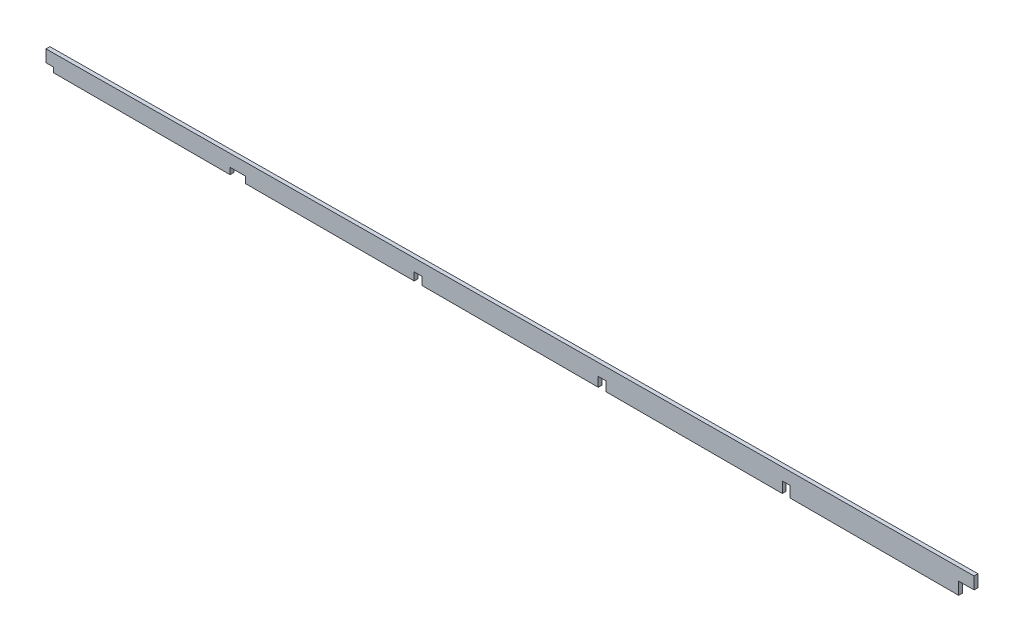
ISO-10303-21;
HEADER;
FILE_DESCRIPTION(('STEP AP214'),'2;1');
FILE_NAME('part.step','',(''),(''),'','','');
FILE_SCHEMA(('AUTOMOTIVE_DESIGN { 1 0 10303 214 1 1 1 1 }'));
ENDSEC;
DATA;
#1=APPLICATION_CONTEXT('core data for automotive mechanical design processes');
#2=APPLICATION_PROTOCOL_DEFINITION('international standard','automotive_design',2000,#1);
#3=PRODUCT_CONTEXT('',#1,'mechanical');
#4=PRODUCT('Part','Part','',(#3));
#5=PRODUCT_RELATED_PRODUCT_CATEGORY('part','',(#4));
#6=PRODUCT_DEFINITION_FORMATION('','',#4);
#7=PRODUCT_DEFINITION_CONTEXT('part definition',#1,'design');
#8=PRODUCT_DEFINITION('design','',#6,#7);
#9=PRODUCT_DEFINITION_SHAPE('','',#8);
#10=(LENGTH_UNIT() NAMED_UNIT(*) SI_UNIT(.MILLI.,.METRE.));
#11=(NAMED_UNIT(*) PLANE_ANGLE_UNIT() SI_UNIT($,.RADIAN.));
#12=(NAMED_UNIT(*) SI_UNIT($,.STERADIAN.) SOLID_ANGLE_UNIT());
#13=UNCERTAINTY_MEASURE_WITH_UNIT(LENGTH_MEASURE(1.E-05),#10,'distance_accuracy_value','');
#14=(GEOMETRIC_REPRESENTATION_CONTEXT(3) GLOBAL_UNCERTAINTY_ASSIGNED_CONTEXT((#13)) GLOBAL_UNIT_ASSIGNED_CONTEXT((#10,
#11,#12)) REPRESENTATION_CONTEXT('',''));
#15=CARTESIAN_POINT('',(0.,0.,0.));
#16=DIRECTION('',(0.,0.,1.));
#17=DIRECTION('',(1.,0.,0.));
#18=AXIS2_PLACEMENT_3D('',#15,#16,#17);
#19=CARTESIAN_POINT('',(0.,0.,0.));
#20=DIRECTION('',(0.,0.,-1.));
#21=DIRECTION('',(-1.,0.,0.));
#22=AXIS2_PLACEMENT_3D('',#19,#20,#21);
#23=PLANE('',#22);
#24=DIRECTION('',(0.,1.,0.));
#25=VECTOR('',#24,1.);
#26=CARTESIAN_POINT('',(88.3255528409319,-0.566216395521648,0.));
#27=LINE('',#26,#25);
#28=CARTESIAN_POINT('',(88.3255528409319,-0.566216395521648,0.));
#29=VERTEX_POINT('',#28);
#30=CARTESIAN_POINT('',(88.3255528409319,4.4065819969315,0.));
#31=VERTEX_POINT('',#30);
#32=EDGE_CURVE('E204',#29,#31,#27,.T.);
#33=ORIENTED_EDGE('',*,*,#32,.F.);
#34=DIRECTION('',(0.99996694520862,0.00813071276950203,0.));
#35=VECTOR('',#34,1.);
#36=CARTESIAN_POINT('',(81.9755528409093,-0.617848128284325,0.));
#37=LINE('',#36,#35);
#38=CARTESIAN_POINT('',(81.9755528409093,-0.617848128284325,0.));
#39=VERTEX_POINT('',#38);
#40=EDGE_CURVE('E275',#39,#29,#37,.T.);
#41=ORIENTED_EDGE('',*,*,#40,.F.);
#42=DIRECTION('',(0.,-1.,0.));
#43=VECTOR('',#42,1.);
#44=CARTESIAN_POINT('',(81.9755528409093,-0.617848128284325,0.));
#45=LINE('',#44,#43);
#46=CARTESIAN_POINT('',(81.9755528409093,-5.67030449490094,0.));
#47=VERTEX_POINT('',#46);
#48=EDGE_CURVE('E272',#39,#47,#45,.T.);
#49=ORIENTED_EDGE('',*,*,#48,.T.);
#50=DIRECTION('',(1.,0.,0.));
#51=VECTOR('',#50,1.);
#52=CARTESIAN_POINT('',(12.7605528406622,-5.67030449490094,0.));
#53=LINE('',#52,#51);
#54=CARTESIAN_POINT('',(12.7605528406622,-5.67030449490094,0.));
#55=VERTEX_POINT('',#54);
#56=EDGE_CURVE('E269',#55,#47,#53,.T.);
#57=ORIENTED_EDGE('',*,*,#56,.F.);
#58=DIRECTION('',(0.,-1.,0.));
#59=VECTOR('',#58,1.);
#60=CARTESIAN_POINT('',(12.7605528406622,-1.18063401539752,0.));
#61=LINE('',#60,#59);
#62=CARTESIAN_POINT('',(12.7605528406622,-1.18063401539752,0.));
#63=VERTEX_POINT('',#62);
#64=EDGE_CURVE('E266',#63,#55,#61,.T.);
#65=ORIENTED_EDGE('',*,*,#64,.F.);
#66=DIRECTION('',(0.99996694520862,0.00813071276950239,0.));
#67=VECTOR('',#66,1.);
#68=CARTESIAN_POINT('',(9.58555284065082,-1.20644988177886,0.));
#69=LINE('',#68,#67);
#70=CARTESIAN_POINT('',(9.58555284065082,-1.20644988177886,0.));
#71=VERTEX_POINT('',#70);
#72=EDGE_CURVE('E263',#71,#63,#69,.T.);
#73=ORIENTED_EDGE('',*,*,#72,.F.);
#74=DIRECTION('',(0.,-1.,0.));
#75=VECTOR('',#74,1.);
#76=CARTESIAN_POINT('',(9.58555284065082,-1.20644988177886,0.));
#77=LINE('',#76,#75);
#78=CARTESIAN_POINT('',(9.58555284065082,-5.67030449490094,0.));
#79=VERTEX_POINT('',#78);
#80=EDGE_CURVE('E260',#71,#79,#77,.T.);
#81=ORIENTED_EDGE('',*,*,#80,.T.);
#82=DIRECTION('',(1.,0.,0.));
#83=VECTOR('',#82,1.);
#84=CARTESIAN_POINT('',(-62.8044471596074,-5.67030449490094,0.));
#85=LINE('',#84,#83);
#86=CARTESIAN_POINT('',(-62.8044471596074,-5.67030449490094,0.));
#87=VERTEX_POINT('',#86);
#88=EDGE_CURVE('E257',#87,#79,#85,.T.);
#89=ORIENTED_EDGE('',*,*,#88,.F.);
#90=DIRECTION('',(0.,-1.,0.));
#91=VECTOR('',#90,1.);
#92=CARTESIAN_POINT('',(-62.8044471596074,-1.79505163527338,0.));
#93=LINE('',#92,#91);
#94=CARTESIAN_POINT('',(-62.8044471596074,-1.79505163527338,0.));
#95=VERTEX_POINT('',#94);
#96=EDGE_CURVE('E254',#95,#87,#93,.T.);
#97=ORIENTED_EDGE('',*,*,#96,.F.);
#98=DIRECTION('',(0.99996694520862,0.00813071276950199,0.));
#99=VECTOR('',#98,1.);
#100=CARTESIAN_POINT('',(-65.9794471596188,-1.82086750165472,0.));
#101=LINE('',#100,#99);
#102=CARTESIAN_POINT('',(-65.9794471596188,-1.82086750165472,0.));
#103=VERTEX_POINT('',#102);
#104=EDGE_CURVE('E251',#103,#95,#101,.T.);
#105=ORIENTED_EDGE('',*,*,#104,.F.);
#106=DIRECTION('',(0.,-1.,0.));
#107=VECTOR('',#106,1.);
#108=CARTESIAN_POINT('',(-65.9794471596188,-1.82086750165472,0.));
#109=LINE('',#108,#107);
#110=CARTESIAN_POINT('',(-65.9794471596188,-5.67030449490094,0.));
#111=VERTEX_POINT('',#110);
#112=EDGE_CURVE('E248',#103,#111,#109,.T.);
#113=ORIENTED_EDGE('',*,*,#112,.T.);
#114=DIRECTION('',(1.,0.,0.));
#115=VECTOR('',#114,1.);
#116=CARTESIAN_POINT('',(-138.369447159877,-5.67030449490094,0.));
#117=LINE('',#116,#115);
#118=CARTESIAN_POINT('',(-138.369447159877,-5.67030449490094,0.));
#119=VERTEX_POINT('',#118);
#120=EDGE_CURVE('E245',#119,#111,#117,.T.);
#121=ORIENTED_EDGE('',*,*,#120,.F.);
#122=DIRECTION('',(0.,-1.,0.));
#123=VECTOR('',#122,1.);
#124=CARTESIAN_POINT('',(-138.369447159877,-2.40946925514922,0.));
#125=LINE('',#124,#123);
#126=CARTESIAN_POINT('',(-138.369447159877,-2.40946925514922,0.));
#127=VERTEX_POINT('',#126);
#128=EDGE_CURVE('E242',#127,#119,#125,.T.);
#129=ORIENTED_EDGE('',*,*,#128,.F.);
#130=DIRECTION('',(0.99996694520862,0.00813071276950203,0.));
#131=VECTOR('',#130,1.);
#132=CARTESIAN_POINT('',(-141.544447159889,-2.43528512153056,0.));
#133=LINE('',#132,#131);
#134=CARTESIAN_POINT('',(-141.544447159889,-2.43528512153056,0.));
#135=VERTEX_POINT('',#134);
#136=EDGE_CURVE('E239',#135,#127,#133,.T.);
#137=ORIENTED_EDGE('',*,*,#136,.F.);
#138=DIRECTION('',(0.,-1.,0.));
#139=VECTOR('',#138,1.);
#140=CARTESIAN_POINT('',(-141.544447159889,-2.43528512153056,0.));
#141=LINE('',#140,#139);
#142=CARTESIAN_POINT('',(-141.544447159889,-5.67030449490094,0.));
#143=VERTEX_POINT('',#142);
#144=EDGE_CURVE('E236',#135,#143,#141,.T.);
#145=ORIENTED_EDGE('',*,*,#144,.T.);
#146=DIRECTION('',(1.,0.,0.));
#147=VECTOR('',#146,1.);
#148=CARTESIAN_POINT('',(-210.759447160136,-5.67030449490094,0.));
#149=LINE('',#148,#147);
#150=CARTESIAN_POINT('',(-210.759447160136,-5.67030449490094,0.));
#151=VERTEX_POINT('',#150);
#152=EDGE_CURVE('E233',#151,#143,#149,.T.);
#153=ORIENTED_EDGE('',*,*,#152,.F.);
#154=DIRECTION('',(0.,-1.,0.));
#155=VECTOR('',#154,1.);
#156=CARTESIAN_POINT('',(-210.759447160136,-2.99807100864374,0.));
#157=LINE('',#156,#155);
#158=CARTESIAN_POINT('',(-210.759447160136,-2.99807100864374,0.));
#159=VERTEX_POINT('',#158);
#160=EDGE_CURVE('E230',#159,#151,#157,.T.);
#161=ORIENTED_EDGE('',*,*,#160,.F.);
#162=DIRECTION('',(0.99996694520862,0.00813071276950425,0.));
#163=VECTOR('',#162,1.);
#164=CARTESIAN_POINT('',(-217.109447160158,-3.04970274140643,0.));
#165=LINE('',#164,#163);
#166=CARTESIAN_POINT('',(-217.109447160158,-3.04970274140643,0.));
#167=VERTEX_POINT('',#166);
#168=EDGE_CURVE('E227',#167,#159,#165,.T.);
#169=ORIENTED_EDGE('',*,*,#168,.F.);
#170=DIRECTION('',(0.,-1.,0.));
#171=VECTOR('',#170,1.);
#172=CARTESIAN_POINT('',(-217.109447160158,-3.04970274140643,0.));
#173=LINE('',#172,#171);
#174=CARTESIAN_POINT('',(-217.109447160158,-5.67030449490094,0.));
#175=VERTEX_POINT('',#174);
#176=EDGE_CURVE('E224',#167,#175,#173,.T.);
#177=ORIENTED_EDGE('',*,*,#176,.T.);
#178=DIRECTION('',(1.,0.,0.));
#179=VECTOR('',#178,1.);
#180=CARTESIAN_POINT('',(-289.499447160417,-5.67030449490094,0.));
#181=LINE('',#180,#179);
#182=CARTESIAN_POINT('',(-289.499447160417,-5.67030449490094,0.));
#183=VERTEX_POINT('',#182);
#184=EDGE_CURVE('E221',#183,#175,#181,.T.);
#185=ORIENTED_EDGE('',*,*,#184,.F.);
#186=DIRECTION('',(0.,-1.,0.));
#187=VECTOR('',#186,1.);
#188=CARTESIAN_POINT('',(-289.499447160417,-3.63830449490094,0.));
#189=LINE('',#188,#187);
#190=CARTESIAN_POINT('',(-289.499447160417,-3.63830449490094,0.));
#191=VERTEX_POINT('',#190);
#192=EDGE_CURVE('E218',#191,#183,#189,.T.);
#193=ORIENTED_EDGE('',*,*,#192,.F.);
#194=DIRECTION('',(-0.99996694520862,-0.00813071276950215,0.));
#195=VECTOR('',#194,1.);
#196=CARTESIAN_POINT('',(-289.499447160417,-3.63830449490094,0.));
#197=LINE('',#196,#195);
#198=CARTESIAN_POINT('',(-292.674447160428,-3.66412036128229,0.));
#199=VERTEX_POINT('',#198);
#200=EDGE_CURVE('E216',#191,#199,#197,.T.);
#201=ORIENTED_EDGE('',*,*,#200,.T.);
#202=DIRECTION('',(0.,-1.,0.));
#203=VECTOR('',#202,1.);
#204=CARTESIAN_POINT('',(-292.674447160428,1.29123622280039,0.));
#205=LINE('',#204,#203);
#206=CARTESIAN_POINT('',(-292.674447160428,1.29123622280039,0.));
#207=VERTEX_POINT('',#206);
#208=EDGE_CURVE('E207',#207,#199,#205,.T.);
#209=ORIENTED_EDGE('',*,*,#208,.F.);
#210=DIRECTION('',(-0.99996657196958,-0.00817648722899392,0.));
#211=VECTOR('',#210,1.);
#212=CARTESIAN_POINT('',(88.3255528409319,4.4065819969315,0.));
#213=LINE('',#212,#211);
#214=EDGE_CURVE('E196',#31,#207,#213,.T.);
#215=ORIENTED_EDGE('',*,*,#214,.F.);
#216=EDGE_LOOP('',(#33,#41,#49,#57,#65,#73,#81,#89,#97,#105,#113,#121,#129,#137,#145,#153,#161,
#169,#177,#185,#193,#201,#209,#215));
#217=FACE_BOUND('',#216,.T.);
#218=ADVANCED_FACE('F32',(#217),#23,.T.);
#219=CARTESIAN_POINT('',(81.9755528409093,-0.617848128284325,382.720736076836));
#220=DIRECTION('',(-0.00813071276950203,0.99996694520862,0.));
#221=DIRECTION('',(-0.99996694520862,-0.00813071276950203,0.));
#222=AXIS2_PLACEMENT_3D('',#219,#220,#221);
#223=PLANE('',#222);
#224=DIRECTION('',(0.,0.,-1.));
#225=VECTOR('',#224,1.);
#226=CARTESIAN_POINT('',(88.3255528409319,-0.566216395521648,382.720736076836));
#227=LINE('',#226,#225);
#228=CARTESIAN_POINT('',(88.3255528409319,-0.566216395521648,1.58749999999436));
#229=VERTEX_POINT('',#228);
#230=EDGE_CURVE('E210',#229,#29,#227,.T.);
#231=ORIENTED_EDGE('',*,*,#230,.F.);
#232=DIRECTION('',(-0.999966945208621,-0.00813071276950203,0.));
#233=VECTOR('',#232,1.);
#234=CARTESIAN_POINT('',(81.9755528409093,-0.617848128284325,1.58749999999436));
#235=LINE('',#234,#233);
#236=CARTESIAN_POINT('',(81.9755528409093,-0.617848128284325,1.58749999999436));
#237=VERTEX_POINT('',#236);
#238=EDGE_CURVE('E36',#229,#237,#235,.T.);
#239=ORIENTED_EDGE('',*,*,#238,.T.);
#240=DIRECTION('',(0.,0.,-1.));
#241=VECTOR('',#240,1.);
#242=CARTESIAN_POINT('',(81.9755528409093,-0.617848128284325,382.720736076836));
#243=LINE('',#242,#241);
#244=EDGE_CURVE('E278',#237,#39,#243,.T.);
#245=ORIENTED_EDGE('',*,*,#244,.T.);
#246=ORIENTED_EDGE('',*,*,#40,.T.);
#247=EDGE_LOOP('',(#231,#239,#245,#246));
#248=FACE_BOUND('',#247,.T.);
#249=ADVANCED_FACE('F382',(#248),#223,.F.);
#250=CARTESIAN_POINT('',(81.9755528409093,-0.617848128284325,382.720736076836));
#251=DIRECTION('',(1.,0.,0.));
#252=DIRECTION('',(0.,0.,-1.));
#253=AXIS2_PLACEMENT_3D('',#250,#251,#252);
#254=PLANE('',#253);
#255=DIRECTION('',(0.,1.,0.));
#256=VECTOR('',#255,1.);
#257=CARTESIAN_POINT('',(81.9755528409093,-0.617848128286233,1.58749999999441));
#258=LINE('',#257,#256);
#259=CARTESIAN_POINT('',(81.9755528409093,-5.67030449490094,1.58749999999444));
#260=VERTEX_POINT('',#259);
#261=EDGE_CURVE('E377',#260,#237,#258,.T.);
#262=ORIENTED_EDGE('',*,*,#261,.F.);
#263=DIRECTION('',(0.,0.,-1.));
#264=VECTOR('',#263,1.);
#265=CARTESIAN_POINT('',(81.9755528409093,-5.67030449490094,382.720736076836));
#266=LINE('',#265,#264);
#267=EDGE_CURVE('E280',#260,#47,#266,.T.);
#268=ORIENTED_EDGE('',*,*,#267,.T.);
#269=ORIENTED_EDGE('',*,*,#48,.F.);
#270=ORIENTED_EDGE('',*,*,#244,.F.);
#271=EDGE_LOOP('',(#262,#268,#269,#270));
#272=FACE_BOUND('',#271,.T.);
#273=ADVANCED_FACE('F394',(#272),#254,.T.);
#274=CARTESIAN_POINT('',(12.7605528406622,-5.67030449490094,382.720736076836));
#275=DIRECTION('',(0.,1.,0.));
#276=DIRECTION('',(0.,0.,1.));
#277=AXIS2_PLACEMENT_3D('',#274,#275,#276);
#278=PLANE('',#277);
#279=ORIENTED_EDGE('',*,*,#267,.F.);
#280=DIRECTION('',(-1.,0.,0.));
#281=VECTOR('',#280,1.);
#282=CARTESIAN_POINT('',(12.7605528406622,-5.67030449490094,1.58749999999447));
#283=LINE('',#282,#281);
#284=CARTESIAN_POINT('',(12.7605528406622,-5.67030449490094,1.58749999999447));
#285=VERTEX_POINT('',#284);
#286=EDGE_CURVE('E374',#260,#285,#283,.T.);
#287=ORIENTED_EDGE('',*,*,#286,.T.);
#288=DIRECTION('',(0.,0.,-1.));
#289=VECTOR('',#288,1.);
#290=CARTESIAN_POINT('',(12.7605528406622,-5.67030449490094,382.720736076836));
#291=LINE('',#290,#289);
#292=EDGE_CURVE('E282',#285,#55,#291,.T.);
#293=ORIENTED_EDGE('',*,*,#292,.T.);
#294=ORIENTED_EDGE('',*,*,#56,.T.);
#295=EDGE_LOOP('',(#279,#287,#293,#294));
#296=FACE_BOUND('',#295,.T.);
#297=ADVANCED_FACE('F399',(#296),#278,.F.);
#298=CARTESIAN_POINT('',(12.7605528406622,-1.18063401539752,382.720736076836));
#299=DIRECTION('',(1.,0.,0.));
#300=DIRECTION('',(0.,0.,-1.));
#301=AXIS2_PLACEMENT_3D('',#298,#299,#300);
#302=PLANE('',#301);
#303=ORIENTED_EDGE('',*,*,#292,.F.);
#304=DIRECTION('',(0.,1.,0.));
#305=VECTOR('',#304,1.);
#306=CARTESIAN_POINT('',(12.7605528406622,-1.18063401539942,1.58749999999441));
#307=LINE('',#306,#305);
#308=CARTESIAN_POINT('',(12.7605528406622,-1.18063401539752,1.58749999999441));
#309=VERTEX_POINT('',#308);
#310=EDGE_CURVE('E371',#285,#309,#307,.T.);
#311=ORIENTED_EDGE('',*,*,#310,.T.);
#312=DIRECTION('',(0.,0.,-1.));
#313=VECTOR('',#312,1.);
#314=CARTESIAN_POINT('',(12.7605528406622,-1.18063401539752,382.720736076836));
#315=LINE('',#314,#313);
#316=EDGE_CURVE('E284',#309,#63,#315,.T.);
#317=ORIENTED_EDGE('',*,*,#316,.T.);
#318=ORIENTED_EDGE('',*,*,#64,.T.);
#319=EDGE_LOOP('',(#303,#311,#317,#318));
#320=FACE_BOUND('',#319,.T.);
#321=ADVANCED_FACE('F403',(#320),#302,.F.);
#322=CARTESIAN_POINT('',(9.58555284065082,-1.20644988177886,382.720736076836));
#323=DIRECTION('',(-0.00813071276950239,0.99996694520862,0.));
#324=DIRECTION('',(-0.99996694520862,-0.00813071276950239,0.));
#325=AXIS2_PLACEMENT_3D('',#322,#323,#324);
#326=PLANE('',#325);
#327=ORIENTED_EDGE('',*,*,#316,.F.);
#328=DIRECTION('',(-0.999966945208621,-0.00813071276950239,0.));
#329=VECTOR('',#328,1.);
#330=CARTESIAN_POINT('',(9.58555284065085,-1.20644988177886,1.58749999999436));
#331=LINE('',#330,#329);
#332=CARTESIAN_POINT('',(9.58555284065082,-1.20644988177886,1.58749999999436));
#333=VERTEX_POINT('',#332);
#334=EDGE_CURVE('E368',#309,#333,#331,.T.);
#335=ORIENTED_EDGE('',*,*,#334,.T.);
#336=DIRECTION('',(0.,0.,-1.));
#337=VECTOR('',#336,1.);
#338=CARTESIAN_POINT('',(9.58555284065082,-1.20644988177886,382.720736076836));
#339=LINE('',#338,#337);
#340=EDGE_CURVE('E286',#333,#71,#339,.T.);
#341=ORIENTED_EDGE('',*,*,#340,.T.);
#342=ORIENTED_EDGE('',*,*,#72,.T.);
#343=EDGE_LOOP('',(#327,#335,#341,#342));
#344=FACE_BOUND('',#343,.T.);
#345=ADVANCED_FACE('F407',(#344),#326,.F.);
#346=CARTESIAN_POINT('',(9.58555284065082,-1.20644988177886,382.720736076836));
#347=DIRECTION('',(1.,0.,0.));
#348=DIRECTION('',(0.,0.,-1.));
#349=AXIS2_PLACEMENT_3D('',#346,#347,#348);
#350=PLANE('',#349);
#351=DIRECTION('',(0.,1.,0.));
#352=VECTOR('',#351,1.);
#353=CARTESIAN_POINT('',(9.58555284065082,-1.20644988178076,1.58749999999441));
#354=LINE('',#353,#352);
#355=CARTESIAN_POINT('',(9.58555284065082,-5.67030449490094,1.58749999999444));
#356=VERTEX_POINT('',#355);
#357=EDGE_CURVE('E366',#356,#333,#354,.T.);
#358=ORIENTED_EDGE('',*,*,#357,.F.);
#359=DIRECTION('',(0.,0.,-1.));
#360=VECTOR('',#359,1.);
#361=CARTESIAN_POINT('',(9.58555284065082,-5.67030449490094,382.720736076836));
#362=LINE('',#361,#360);
#363=EDGE_CURVE('E288',#356,#79,#362,.T.);
#364=ORIENTED_EDGE('',*,*,#363,.T.);
#365=ORIENTED_EDGE('',*,*,#80,.F.);
#366=ORIENTED_EDGE('',*,*,#340,.F.);
#367=EDGE_LOOP('',(#358,#364,#365,#366));
#368=FACE_BOUND('',#367,.T.);
#369=ADVANCED_FACE('F411',(#368),#350,.T.);
#370=CARTESIAN_POINT('',(-62.8044471596074,-5.67030449490094,382.720736076836));
#371=DIRECTION('',(0.,1.,0.));
#372=DIRECTION('',(0.,0.,1.));
#373=AXIS2_PLACEMENT_3D('',#370,#371,#372);
#374=PLANE('',#373);
#375=ORIENTED_EDGE('',*,*,#363,.F.);
#376=DIRECTION('',(-1.,0.,0.));
#377=VECTOR('',#376,1.);
#378=CARTESIAN_POINT('',(-62.8044471596074,-5.67030449490094,1.58749999999447));
#379=LINE('',#378,#377);
#380=CARTESIAN_POINT('',(-62.8044471596074,-5.67030449490094,1.58749999999447));
#381=VERTEX_POINT('',#380);
#382=EDGE_CURVE('E363',#356,#381,#379,.T.);
#383=ORIENTED_EDGE('',*,*,#382,.T.);
#384=DIRECTION('',(0.,0.,-1.));
#385=VECTOR('',#384,1.);
#386=CARTESIAN_POINT('',(-62.8044471596074,-5.67030449490094,382.720736076836));
#387=LINE('',#386,#385);
#388=EDGE_CURVE('E290',#381,#87,#387,.T.);
#389=ORIENTED_EDGE('',*,*,#388,.T.);
#390=ORIENTED_EDGE('',*,*,#88,.T.);
#391=EDGE_LOOP('',(#375,#383,#389,#390));
#392=FACE_BOUND('',#391,.T.);
#393=ADVANCED_FACE('F415',(#392),#374,.F.);
#394=CARTESIAN_POINT('',(-62.8044471596074,-1.79505163527338,382.720736076836));
#395=DIRECTION('',(1.,0.,0.));
#396=DIRECTION('',(0.,0.,-1.));
#397=AXIS2_PLACEMENT_3D('',#394,#395,#396);
#398=PLANE('',#397);
#399=ORIENTED_EDGE('',*,*,#388,.F.);
#400=DIRECTION('',(0.,1.,0.));
#401=VECTOR('',#400,1.);
#402=CARTESIAN_POINT('',(-62.8044471596074,-1.79505163527529,1.58749999999441));
#403=LINE('',#402,#401);
#404=CARTESIAN_POINT('',(-62.8044471596074,-1.79505163527338,1.58749999999441));
#405=VERTEX_POINT('',#404);
#406=EDGE_CURVE('E360',#381,#405,#403,.T.);
#407=ORIENTED_EDGE('',*,*,#406,.T.);
#408=DIRECTION('',(0.,0.,-1.));
#409=VECTOR('',#408,1.);
#410=CARTESIAN_POINT('',(-62.8044471596074,-1.79505163527338,382.720736076836));
#411=LINE('',#410,#409);
#412=EDGE_CURVE('E292',#405,#95,#411,.T.);
#413=ORIENTED_EDGE('',*,*,#412,.T.);
#414=ORIENTED_EDGE('',*,*,#96,.T.);
#415=EDGE_LOOP('',(#399,#407,#413,#414));
#416=FACE_BOUND('',#415,.T.);
#417=ADVANCED_FACE('F419',(#416),#398,.F.);
#418=CARTESIAN_POINT('',(-65.9794471596188,-1.82086750165472,382.720736076836));
#419=DIRECTION('',(-0.00813071276950199,0.99996694520862,0.));
#420=DIRECTION('',(-0.99996694520862,-0.00813071276950199,0.));
#421=AXIS2_PLACEMENT_3D('',#418,#419,#420);
#422=PLANE('',#421);
#423=ORIENTED_EDGE('',*,*,#412,.F.);
#424=DIRECTION('',(-0.999966945208621,-0.00813071276950199,0.));
#425=VECTOR('',#424,1.);
#426=CARTESIAN_POINT('',(-65.9794471596188,-1.82086750165472,1.58749999999436));
#427=LINE('',#426,#425);
#428=CARTESIAN_POINT('',(-65.9794471596188,-1.82086750165472,1.58749999999436));
#429=VERTEX_POINT('',#428);
#430=EDGE_CURVE('E357',#405,#429,#427,.T.);
#431=ORIENTED_EDGE('',*,*,#430,.T.);
#432=DIRECTION('',(0.,0.,-1.));
#433=VECTOR('',#432,1.);
#434=CARTESIAN_POINT('',(-65.9794471596188,-1.82086750165472,382.720736076836));
#435=LINE('',#434,#433);
#436=EDGE_CURVE('E294',#429,#103,#435,.T.);
#437=ORIENTED_EDGE('',*,*,#436,.T.);
#438=ORIENTED_EDGE('',*,*,#104,.T.);
#439=EDGE_LOOP('',(#423,#431,#437,#438));
#440=FACE_BOUND('',#439,.T.);
#441=ADVANCED_FACE('F423',(#440),#422,.F.);
#442=CARTESIAN_POINT('',(-65.9794471596188,-1.82086750165472,382.720736076836));
#443=DIRECTION('',(1.,0.,0.));
#444=DIRECTION('',(0.,0.,-1.));
#445=AXIS2_PLACEMENT_3D('',#442,#443,#444);
#446=PLANE('',#445);
#447=DIRECTION('',(0.,1.,0.));
#448=VECTOR('',#447,1.);
#449=CARTESIAN_POINT('',(-65.9794471596188,-1.82086750165663,1.58749999999441));
#450=LINE('',#449,#448);
#451=CARTESIAN_POINT('',(-65.9794471596188,-5.67030449490094,1.58749999999443));
#452=VERTEX_POINT('',#451);
#453=EDGE_CURVE('E355',#452,#429,#450,.T.);
#454=ORIENTED_EDGE('',*,*,#453,.F.);
#455=DIRECTION('',(0.,0.,-1.));
#456=VECTOR('',#455,1.);
#457=CARTESIAN_POINT('',(-65.9794471596188,-5.67030449490094,382.720736076836));
#458=LINE('',#457,#456);
#459=EDGE_CURVE('E296',#452,#111,#458,.T.);
#460=ORIENTED_EDGE('',*,*,#459,.T.);
#461=ORIENTED_EDGE('',*,*,#112,.F.);
#462=ORIENTED_EDGE('',*,*,#436,.F.);
#463=EDGE_LOOP('',(#454,#460,#461,#462));
#464=FACE_BOUND('',#463,.T.);
#465=ADVANCED_FACE('F427',(#464),#446,.T.);
#466=CARTESIAN_POINT('',(-138.369447159877,-5.67030449490094,382.720736076836));
#467=DIRECTION('',(0.,1.,0.));
#468=DIRECTION('',(0.,0.,1.));
#469=AXIS2_PLACEMENT_3D('',#466,#467,#468);
#470=PLANE('',#469);
#471=ORIENTED_EDGE('',*,*,#459,.F.);
#472=DIRECTION('',(-1.,0.,0.));
#473=VECTOR('',#472,1.);
#474=CARTESIAN_POINT('',(-138.369447159877,-5.67030449490094,1.58749999999441));
#475=LINE('',#474,#473);
#476=CARTESIAN_POINT('',(-138.369447159877,-5.67030449490094,1.58749999999441));
#477=VERTEX_POINT('',#476);
#478=EDGE_CURVE('E352',#452,#477,#475,.T.);
#479=ORIENTED_EDGE('',*,*,#478,.T.);
#480=DIRECTION('',(0.,0.,-1.));
#481=VECTOR('',#480,1.);
#482=CARTESIAN_POINT('',(-138.369447159877,-5.67030449490094,382.720736076836));
#483=LINE('',#482,#481);
#484=EDGE_CURVE('E298',#477,#119,#483,.T.);
#485=ORIENTED_EDGE('',*,*,#484,.T.);
#486=ORIENTED_EDGE('',*,*,#120,.T.);
#487=EDGE_LOOP('',(#471,#479,#485,#486));
#488=FACE_BOUND('',#487,.T.);
#489=ADVANCED_FACE('F431',(#488),#470,.F.);
#490=CARTESIAN_POINT('',(-138.369447159877,-2.40946925514922,382.720736076836));
#491=DIRECTION('',(1.,0.,0.));
#492=DIRECTION('',(0.,0.,-1.));
#493=AXIS2_PLACEMENT_3D('',#490,#491,#492);
#494=PLANE('',#493);
#495=ORIENTED_EDGE('',*,*,#484,.F.);
#496=DIRECTION('',(0.,1.,0.));
#497=VECTOR('',#496,1.);
#498=CARTESIAN_POINT('',(-138.369447159877,-2.40946925515113,1.58749999999441));
#499=LINE('',#498,#497);
#500=CARTESIAN_POINT('',(-138.369447159877,-2.40946925514922,1.58749999999441));
#501=VERTEX_POINT('',#500);
#502=EDGE_CURVE('E349',#477,#501,#499,.T.);
#503=ORIENTED_EDGE('',*,*,#502,.T.);
#504=DIRECTION('',(0.,0.,-1.));
#505=VECTOR('',#504,1.);
#506=CARTESIAN_POINT('',(-138.369447159877,-2.40946925514922,382.720736076836));
#507=LINE('',#506,#505);
#508=EDGE_CURVE('E300',#501,#127,#507,.T.);
#509=ORIENTED_EDGE('',*,*,#508,.T.);
#510=ORIENTED_EDGE('',*,*,#128,.T.);
#511=EDGE_LOOP('',(#495,#503,#509,#510));
#512=FACE_BOUND('',#511,.T.);
#513=ADVANCED_FACE('F435',(#512),#494,.F.);
#514=CARTESIAN_POINT('',(-141.544447159889,-2.43528512153056,382.720736076836));
#515=DIRECTION('',(-0.00813071276950203,0.99996694520862,0.));
#516=DIRECTION('',(-0.99996694520862,-0.00813071276950203,0.));
#517=AXIS2_PLACEMENT_3D('',#514,#515,#516);
#518=PLANE('',#517);
#519=ORIENTED_EDGE('',*,*,#508,.F.);
#520=DIRECTION('',(-0.999966945208621,-0.00813071276950203,0.));
#521=VECTOR('',#520,1.);
#522=CARTESIAN_POINT('',(-141.544447159888,-2.43528512153056,1.58749999999436));
#523=LINE('',#522,#521);
#524=CARTESIAN_POINT('',(-141.544447159889,-2.43528512153056,1.58749999999436));
#525=VERTEX_POINT('',#524);
#526=EDGE_CURVE('E346',#501,#525,#523,.T.);
#527=ORIENTED_EDGE('',*,*,#526,.T.);
#528=DIRECTION('',(0.,0.,-1.));
#529=VECTOR('',#528,1.);
#530=CARTESIAN_POINT('',(-141.544447159889,-2.43528512153056,382.720736076836));
#531=LINE('',#530,#529);
#532=EDGE_CURVE('E302',#525,#135,#531,.T.);
#533=ORIENTED_EDGE('',*,*,#532,.T.);
#534=ORIENTED_EDGE('',*,*,#136,.T.);
#535=EDGE_LOOP('',(#519,#527,#533,#534));
#536=FACE_BOUND('',#535,.T.);
#537=ADVANCED_FACE('F439',(#536),#518,.F.);
#538=CARTESIAN_POINT('',(-141.544447159889,-2.43528512153056,382.720736076836));
#539=DIRECTION('',(1.,0.,0.));
#540=DIRECTION('',(0.,0.,-1.));
#541=AXIS2_PLACEMENT_3D('',#538,#539,#540);
#542=PLANE('',#541);
#543=DIRECTION('',(0.,1.,0.));
#544=VECTOR('',#543,1.);
#545=CARTESIAN_POINT('',(-141.544447159889,-2.43528512153247,1.58749999999441));
#546=LINE('',#545,#544);
#547=CARTESIAN_POINT('',(-141.544447159889,-5.67030449490094,1.58749999999443));
#548=VERTEX_POINT('',#547);
#549=EDGE_CURVE('E344',#548,#525,#546,.T.);
#550=ORIENTED_EDGE('',*,*,#549,.F.);
#551=DIRECTION('',(0.,0.,-1.));
#552=VECTOR('',#551,1.);
#553=CARTESIAN_POINT('',(-141.544447159889,-5.67030449490094,382.720736076836));
#554=LINE('',#553,#552);
#555=EDGE_CURVE('E304',#548,#143,#554,.T.);
#556=ORIENTED_EDGE('',*,*,#555,.T.);
#557=ORIENTED_EDGE('',*,*,#144,.F.);
#558=ORIENTED_EDGE('',*,*,#532,.F.);
#559=EDGE_LOOP('',(#550,#556,#557,#558));
#560=FACE_BOUND('',#559,.T.);
#561=ADVANCED_FACE('F443',(#560),#542,.T.);
#562=CARTESIAN_POINT('',(-210.759447160136,-5.67030449490094,382.720736076836));
#563=DIRECTION('',(0.,1.,0.));
#564=DIRECTION('',(0.,0.,1.));
#565=AXIS2_PLACEMENT_3D('',#562,#563,#564);
#566=PLANE('',#565);
#567=ORIENTED_EDGE('',*,*,#555,.F.);
#568=DIRECTION('',(-1.,0.,0.));
#569=VECTOR('',#568,1.);
#570=CARTESIAN_POINT('',(-210.759447160135,-5.67030449490094,1.58749999999441));
#571=LINE('',#570,#569);
#572=CARTESIAN_POINT('',(-210.759447160136,-5.67030449490094,1.58749999999441));
#573=VERTEX_POINT('',#572);
#574=EDGE_CURVE('E341',#548,#573,#571,.T.);
#575=ORIENTED_EDGE('',*,*,#574,.T.);
#576=DIRECTION('',(0.,0.,-1.));
#577=VECTOR('',#576,1.);
#578=CARTESIAN_POINT('',(-210.759447160136,-5.67030449490094,382.720736076836));
#579=LINE('',#578,#577);
#580=EDGE_CURVE('E306',#573,#151,#579,.T.);
#581=ORIENTED_EDGE('',*,*,#580,.T.);
#582=ORIENTED_EDGE('',*,*,#152,.T.);
#583=EDGE_LOOP('',(#567,#575,#581,#582));
#584=FACE_BOUND('',#583,.T.);
#585=ADVANCED_FACE('F447',(#584),#566,.F.);
#586=CARTESIAN_POINT('',(-210.759447160136,-2.99807100864374,382.720736076836));
#587=DIRECTION('',(1.,0.,0.));
#588=DIRECTION('',(0.,0.,-1.));
#589=AXIS2_PLACEMENT_3D('',#586,#587,#588);
#590=PLANE('',#589);
#591=ORIENTED_EDGE('',*,*,#580,.F.);
#592=DIRECTION('',(0.,1.,0.));
#593=VECTOR('',#592,1.);
#594=CARTESIAN_POINT('',(-210.759447160136,-2.99807100864565,1.58749999999441));
#595=LINE('',#594,#593);
#596=CARTESIAN_POINT('',(-210.759447160136,-2.99807100864374,1.58749999999441));
#597=VERTEX_POINT('',#596);
#598=EDGE_CURVE('E338',#573,#597,#595,.T.);
#599=ORIENTED_EDGE('',*,*,#598,.T.);
#600=DIRECTION('',(0.,0.,-1.));
#601=VECTOR('',#600,1.);
#602=CARTESIAN_POINT('',(-210.759447160136,-2.99807100864374,382.720736076836));
#603=LINE('',#602,#601);
#604=EDGE_CURVE('E308',#597,#159,#603,.T.);
#605=ORIENTED_EDGE('',*,*,#604,.T.);
#606=ORIENTED_EDGE('',*,*,#160,.T.);
#607=EDGE_LOOP('',(#591,#599,#605,#606));
#608=FACE_BOUND('',#607,.T.);
#609=ADVANCED_FACE('F451',(#608),#590,.F.);
#610=CARTESIAN_POINT('',(-217.109447160158,-3.04970274140643,382.720736076836));
#611=DIRECTION('',(-0.00813071276950425,0.99996694520862,0.));
#612=DIRECTION('',(-0.99996694520862,-0.00813071276950425,0.));
#613=AXIS2_PLACEMENT_3D('',#610,#611,#612);
#614=PLANE('',#613);
#615=ORIENTED_EDGE('',*,*,#604,.F.);
#616=DIRECTION('',(-0.99996694520862,-0.00813071276950425,0.));
#617=VECTOR('',#616,1.);
#618=CARTESIAN_POINT('',(-217.109447160158,-3.04970274140643,1.58749999999441));
#619=LINE('',#618,#617);
#620=CARTESIAN_POINT('',(-217.109447160158,-3.04970274140643,1.58749999999441));
#621=VERTEX_POINT('',#620);
#622=EDGE_CURVE('E335',#597,#621,#619,.T.);
#623=ORIENTED_EDGE('',*,*,#622,.T.);
#624=DIRECTION('',(0.,0.,-1.));
#625=VECTOR('',#624,1.);
#626=CARTESIAN_POINT('',(-217.109447160158,-3.04970274140643,382.720736076836));
#627=LINE('',#626,#625);
#628=EDGE_CURVE('E310',#621,#167,#627,.T.);
#629=ORIENTED_EDGE('',*,*,#628,.T.);
#630=ORIENTED_EDGE('',*,*,#168,.T.);
#631=EDGE_LOOP('',(#615,#623,#629,#630));
#632=FACE_BOUND('',#631,.T.);
#633=ADVANCED_FACE('F455',(#632),#614,.F.);
#634=CARTESIAN_POINT('',(-217.109447160158,-3.04970274140643,382.720736076836));
#635=DIRECTION('',(1.,0.,0.));
#636=DIRECTION('',(0.,0.,-1.));
#637=AXIS2_PLACEMENT_3D('',#634,#635,#636);
#638=PLANE('',#637);
#639=DIRECTION('',(0.,1.,0.));
#640=VECTOR('',#639,1.);
#641=CARTESIAN_POINT('',(-217.109447160158,-3.04970274140834,1.58749999999441));
#642=LINE('',#641,#640);
#643=CARTESIAN_POINT('',(-217.109447160158,-5.67030449490094,1.58749999999443));
#644=VERTEX_POINT('',#643);
#645=EDGE_CURVE('E333',#644,#621,#642,.T.);
#646=ORIENTED_EDGE('',*,*,#645,.F.);
#647=DIRECTION('',(0.,0.,-1.));
#648=VECTOR('',#647,1.);
#649=CARTESIAN_POINT('',(-217.109447160158,-5.67030449490094,382.720736076836));
#650=LINE('',#649,#648);
#651=EDGE_CURVE('E312',#644,#175,#650,.T.);
#652=ORIENTED_EDGE('',*,*,#651,.T.);
#653=ORIENTED_EDGE('',*,*,#176,.F.);
#654=ORIENTED_EDGE('',*,*,#628,.F.);
#655=EDGE_LOOP('',(#646,#652,#653,#654));
#656=FACE_BOUND('',#655,.T.);
#657=ADVANCED_FACE('F459',(#656),#638,.T.);
#658=CARTESIAN_POINT('',(-289.499447160417,-5.67030449490094,382.720736076836));
#659=DIRECTION('',(0.,1.,0.));
#660=DIRECTION('',(0.,0.,1.));
#661=AXIS2_PLACEMENT_3D('',#658,#659,#660);
#662=PLANE('',#661);
#663=ORIENTED_EDGE('',*,*,#651,.F.);
#664=DIRECTION('',(-1.,0.,0.));
#665=VECTOR('',#664,1.);
#666=CARTESIAN_POINT('',(-289.499447160416,-5.67030449490094,1.58749999999441));
#667=LINE('',#666,#665);
#668=CARTESIAN_POINT('',(-289.499447160417,-5.67030449490094,1.58749999999441));
#669=VERTEX_POINT('',#668);
#670=EDGE_CURVE('E330',#644,#669,#667,.T.);
#671=ORIENTED_EDGE('',*,*,#670,.T.);
#672=DIRECTION('',(0.,0.,-1.));
#673=VECTOR('',#672,1.);
#674=CARTESIAN_POINT('',(-289.499447160417,-5.67030449490094,382.720736076836));
#675=LINE('',#674,#673);
#676=EDGE_CURVE('E314',#669,#183,#675,.T.);
#677=ORIENTED_EDGE('',*,*,#676,.T.);
#678=ORIENTED_EDGE('',*,*,#184,.T.);
#679=EDGE_LOOP('',(#663,#671,#677,#678));
#680=FACE_BOUND('',#679,.T.);
#681=ADVANCED_FACE('F463',(#680),#662,.F.);
#682=CARTESIAN_POINT('',(-289.499447160417,-3.63830449490094,382.720736076836));
#683=DIRECTION('',(1.,0.,0.));
#684=DIRECTION('',(0.,0.,-1.));
#685=AXIS2_PLACEMENT_3D('',#682,#683,#684);
#686=PLANE('',#685);
#687=ORIENTED_EDGE('',*,*,#676,.F.);
#688=DIRECTION('',(0.,1.,0.));
#689=VECTOR('',#688,1.);
#690=CARTESIAN_POINT('',(-289.499447160417,-3.63830449490285,1.58749999999441));
#691=LINE('',#690,#689);
#692=CARTESIAN_POINT('',(-289.499447160417,-3.63830449490094,1.58749999999441));
#693=VERTEX_POINT('',#692);
#694=EDGE_CURVE('E325',#669,#693,#691,.T.);
#695=ORIENTED_EDGE('',*,*,#694,.T.);
#696=DIRECTION('',(0.,0.,-1.));
#697=VECTOR('',#696,1.);
#698=CARTESIAN_POINT('',(-289.499447160417,-3.63830449490094,382.720736076836));
#699=LINE('',#698,#697);
#700=EDGE_CURVE('E316',#693,#191,#699,.T.);
#701=ORIENTED_EDGE('',*,*,#700,.T.);
#702=ORIENTED_EDGE('',*,*,#192,.T.);
#703=EDGE_LOOP('',(#687,#695,#701,#702));
#704=FACE_BOUND('',#703,.T.);
#705=ADVANCED_FACE('F467',(#704),#686,.F.);
#706=CARTESIAN_POINT('',(-289.499447160417,-3.63830449490094,382.720736076836));
#707=DIRECTION('',(0.00813071276950215,-0.99996694520862,0.));
#708=DIRECTION('',(0.99996694520862,0.00813071276950215,0.));
#709=AXIS2_PLACEMENT_3D('',#706,#707,#708);
#710=PLANE('',#709);
#711=DIRECTION('',(0.999966945208621,0.00813071276950215,0.));
#712=VECTOR('',#711,1.);
#713=CARTESIAN_POINT('',(-289.499447160416,-3.63830449490094,1.58749999999436));
#714=LINE('',#713,#712);
#715=CARTESIAN_POINT('',(-292.674447160428,-3.66412036128229,1.58749999999436));
#716=VERTEX_POINT('',#715);
#717=EDGE_CURVE('E323',#716,#693,#714,.T.);
#718=ORIENTED_EDGE('',*,*,#717,.F.);
#719=DIRECTION('',(0.,0.,-1.));
#720=VECTOR('',#719,1.);
#721=CARTESIAN_POINT('',(-292.674447160428,-3.66412036128229,382.720736076836));
#722=LINE('',#721,#720);
#723=EDGE_CURVE('E318',#716,#199,#722,.T.);
#724=ORIENTED_EDGE('',*,*,#723,.T.);
#725=ORIENTED_EDGE('',*,*,#200,.F.);
#726=ORIENTED_EDGE('',*,*,#700,.F.);
#727=EDGE_LOOP('',(#718,#724,#725,#726));
#728=FACE_BOUND('',#727,.T.);
#729=ADVANCED_FACE('F471',(#728),#710,.T.);
#730=CARTESIAN_POINT('',(-292.674447160428,1.29123622280039,382.720736076836));
#731=DIRECTION('',(1.,0.,0.));
#732=DIRECTION('',(0.,0.,-1.));
#733=AXIS2_PLACEMENT_3D('',#730,#731,#732);
#734=PLANE('',#733);
#735=ORIENTED_EDGE('',*,*,#723,.F.);
#736=DIRECTION('',(0.,1.,0.));
#737=VECTOR('',#736,1.);
#738=CARTESIAN_POINT('',(-292.674447160428,1.29123622279848,1.58749999999441));
#739=LINE('',#738,#737);
#740=CARTESIAN_POINT('',(-292.674447160428,1.29123622280039,1.58749999999441));
#741=VERTEX_POINT('',#740);
#742=EDGE_CURVE('E53',#716,#741,#739,.T.);
#743=ORIENTED_EDGE('',*,*,#742,.T.);
#744=DIRECTION('',(0.,0.,-1.));
#745=VECTOR('',#744,1.);
#746=CARTESIAN_POINT('',(-292.674447160428,1.29123622280039,382.720736076836));
#747=LINE('',#746,#745);
#748=EDGE_CURVE('E200',#741,#207,#747,.T.);
#749=ORIENTED_EDGE('',*,*,#748,.T.);
#750=ORIENTED_EDGE('',*,*,#208,.T.);
#751=EDGE_LOOP('',(#735,#743,#749,#750));
#752=FACE_BOUND('',#751,.T.);
#753=ADVANCED_FACE('F321',(#752),#734,.F.);
#754=CARTESIAN_POINT('',(88.3255528409319,4.4065819969315,382.720736076836));
#755=DIRECTION('',(0.00817648722899392,-0.99996657196958,0.));
#756=DIRECTION('',(0.99996657196958,0.00817648722899392,0.));
#757=AXIS2_PLACEMENT_3D('',#754,#755,#756);
#758=PLANE('',#757);
#759=ORIENTED_EDGE('',*,*,#748,.F.);
#760=DIRECTION('',(0.999966571969581,0.00817648722899392,0.));
#761=VECTOR('',#760,1.);
#762=CARTESIAN_POINT('',(88.3255528409319,4.4065819969315,1.58749999999436));
#763=LINE('',#762,#761);
#764=CARTESIAN_POINT('',(88.3255528409319,4.4065819969315,1.58749999999436));
#765=VERTEX_POINT('',#764);
#766=EDGE_CURVE('E41',#741,#765,#763,.T.);
#767=ORIENTED_EDGE('',*,*,#766,.T.);
#768=DIRECTION('',(0.,0.,-1.));
#769=VECTOR('',#768,1.);
#770=CARTESIAN_POINT('',(88.3255528409319,4.4065819969315,382.720736076836));
#771=LINE('',#770,#769);
#772=EDGE_CURVE('E193',#765,#31,#771,.T.);
#773=ORIENTED_EDGE('',*,*,#772,.T.);
#774=ORIENTED_EDGE('',*,*,#214,.T.);
#775=EDGE_LOOP('',(#759,#767,#773,#774));
#776=FACE_BOUND('',#775,.T.);
#777=ADVANCED_FACE('F195',(#776),#758,.F.);
#778=CARTESIAN_POINT('',(88.3255528409319,-0.566216395521648,382.720736076836));
#779=DIRECTION('',(-1.,0.,0.));
#780=DIRECTION('',(0.,0.,1.));
#781=AXIS2_PLACEMENT_3D('',#778,#779,#780);
#782=PLANE('',#781);
#783=ORIENTED_EDGE('',*,*,#772,.F.);
#784=DIRECTION('',(0.,-1.,0.));
#785=VECTOR('',#784,1.);
#786=CARTESIAN_POINT('',(88.3255528409319,-0.566216395523556,1.58749999999441));
#787=LINE('',#786,#785);
#788=EDGE_CURVE('E11',#765,#229,#787,.T.);
#789=ORIENTED_EDGE('',*,*,#788,.T.);
#790=ORIENTED_EDGE('',*,*,#230,.T.);
#791=ORIENTED_EDGE('',*,*,#32,.T.);
#792=EDGE_LOOP('',(#783,#789,#790,#791));
#793=FACE_BOUND('',#792,.T.);
#794=ADVANCED_FACE('F34',(#793),#782,.F.);
#795=CARTESIAN_POINT('',(62.9260370916752,-7.25098371628546,1.58749999999447));
#796=DIRECTION('',(0.,0.,-1.));
#797=DIRECTION('',(-1.,0.,0.));
#798=AXIS2_PLACEMENT_3D('',#795,#796,#797);
#799=PLANE('',#798);
#800=ORIENTED_EDGE('',*,*,#766,.F.);
#801=ORIENTED_EDGE('',*,*,#742,.F.);
#802=ORIENTED_EDGE('',*,*,#717,.T.);
#803=ORIENTED_EDGE('',*,*,#694,.F.);
#804=ORIENTED_EDGE('',*,*,#670,.F.);
#805=ORIENTED_EDGE('',*,*,#645,.T.);
#806=ORIENTED_EDGE('',*,*,#622,.F.);
#807=ORIENTED_EDGE('',*,*,#598,.F.);
#808=ORIENTED_EDGE('',*,*,#574,.F.);
#809=ORIENTED_EDGE('',*,*,#549,.T.);
#810=ORIENTED_EDGE('',*,*,#526,.F.);
#811=ORIENTED_EDGE('',*,*,#502,.F.);
#812=ORIENTED_EDGE('',*,*,#478,.F.);
#813=ORIENTED_EDGE('',*,*,#453,.T.);
#814=ORIENTED_EDGE('',*,*,#430,.F.);
#815=ORIENTED_EDGE('',*,*,#406,.F.);
#816=ORIENTED_EDGE('',*,*,#382,.F.);
#817=ORIENTED_EDGE('',*,*,#357,.T.);
#818=ORIENTED_EDGE('',*,*,#334,.F.);
#819=ORIENTED_EDGE('',*,*,#310,.F.);
#820=ORIENTED_EDGE('',*,*,#286,.F.);
#821=ORIENTED_EDGE('',*,*,#261,.T.);
#822=ORIENTED_EDGE('',*,*,#238,.F.);
#823=ORIENTED_EDGE('',*,*,#788,.F.);
#824=EDGE_LOOP('',(#800,#801,#802,#803,#804,#805,#806,#807,#808,#809,#810,#811,#812,#813,#814,
#815,#816,#817,#818,#819,#820,#821,#822,#823));
#825=FACE_BOUND('',#824,.T.);
#826=ADVANCED_FACE('F383',(#825),#799,.F.);
#827=CLOSED_SHELL('',(#218,#249,#273,#297,#321,#345,#369,#393,#417,#441,#465,#489,#513,#537,
#561,#585,#609,#633,#657,#681,#705,#729,#753,#777,#794,#826));
#828=MANIFOLD_SOLID_BREP('B2',#827);
#829=ADVANCED_BREP_SHAPE_REPRESENTATION('',(#18,#828),#14);
#830=SHAPE_DEFINITION_REPRESENTATION(#9,#829);
ENDSEC;
END-ISO-10303-21;
